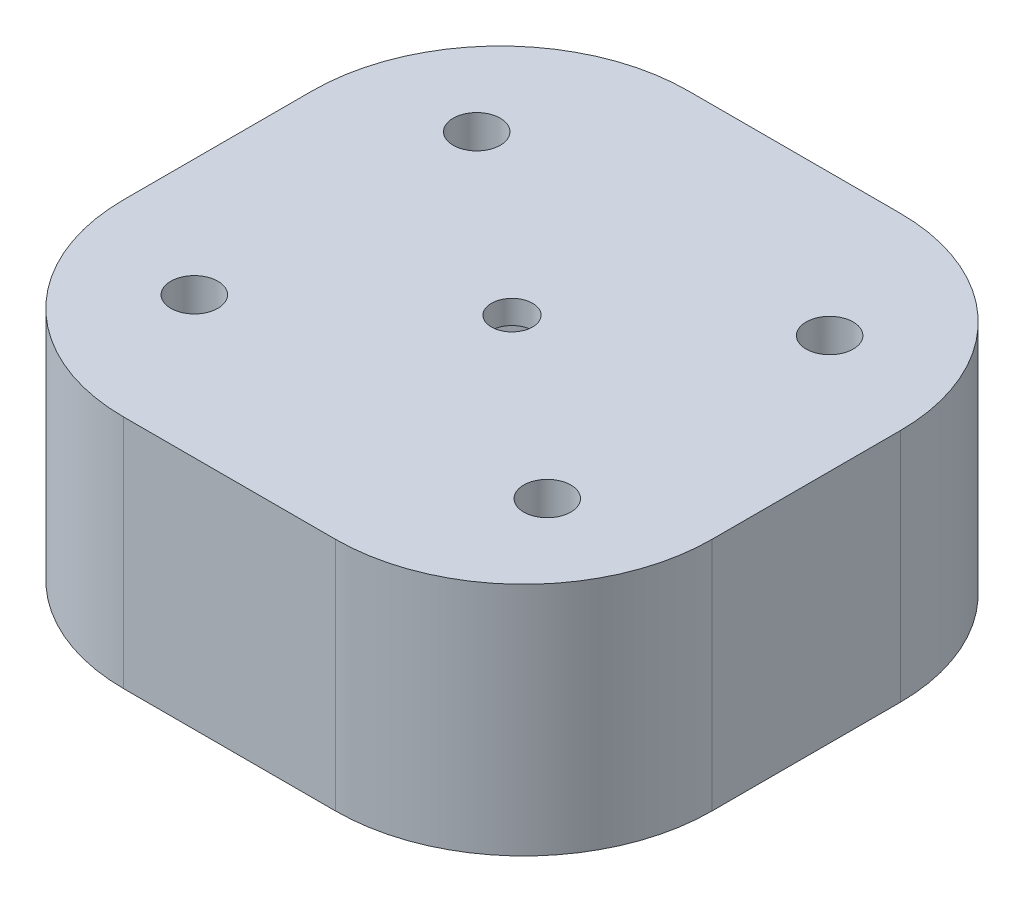
ISO-10303-21;
HEADER;
FILE_DESCRIPTION(('STEP AP214'),'2;1');
FILE_NAME('part.step','',(''),(''),'','','');
FILE_SCHEMA(('AUTOMOTIVE_DESIGN { 1 0 10303 214 1 1 1 1 }'));
ENDSEC;
DATA;
#1=APPLICATION_CONTEXT('core data for automotive mechanical design processes');
#2=APPLICATION_PROTOCOL_DEFINITION('international standard','automotive_design',2000,#1);
#3=PRODUCT_CONTEXT('',#1,'mechanical');
#4=PRODUCT('Part','Part','',(#3));
#5=PRODUCT_RELATED_PRODUCT_CATEGORY('part','',(#4));
#6=PRODUCT_DEFINITION_FORMATION('','',#4);
#7=PRODUCT_DEFINITION_CONTEXT('part definition',#1,'design');
#8=PRODUCT_DEFINITION('design','',#6,#7);
#9=PRODUCT_DEFINITION_SHAPE('','',#8);
#10=(LENGTH_UNIT() NAMED_UNIT(*) SI_UNIT(.MILLI.,.METRE.));
#11=(NAMED_UNIT(*) PLANE_ANGLE_UNIT() SI_UNIT($,.RADIAN.));
#12=(NAMED_UNIT(*) SI_UNIT($,.STERADIAN.) SOLID_ANGLE_UNIT());
#13=UNCERTAINTY_MEASURE_WITH_UNIT(LENGTH_MEASURE(1.E-05),#10,'distance_accuracy_value','');
#14=(GEOMETRIC_REPRESENTATION_CONTEXT(3) GLOBAL_UNCERTAINTY_ASSIGNED_CONTEXT((#13)) GLOBAL_UNIT_ASSIGNED_CONTEXT((#10,
#11,#12)) REPRESENTATION_CONTEXT('',''));
#15=CARTESIAN_POINT('',(0.,0.,0.));
#16=DIRECTION('',(0.,0.,1.));
#17=DIRECTION('',(1.,0.,0.));
#18=AXIS2_PLACEMENT_3D('',#15,#16,#17);
#19=CARTESIAN_POINT('',(-9.00000037252903,0.,8.00000020861626));
#20=DIRECTION('',(0.,1.,0.));
#21=DIRECTION('',(0.,0.,1.));
#22=AXIS2_PLACEMENT_3D('',#19,#20,#21);
#23=PLANE('',#22);
#24=CARTESIAN_POINT('',(-9.00000037252903,0.,8.00000020861626));
#25=DIRECTION('',(0.,1.,0.));
#26=DIRECTION('',(0.,0.,1.));
#27=AXIS2_PLACEMENT_3D('',#24,#25,#26);
#28=CIRCLE('',#27,16.);
#29=CARTESIAN_POINT('',(-25.000000372529,0.,8.00000020861614));
#30=VERTEX_POINT('',#29);
#31=CARTESIAN_POINT('',(-9.00000037252891,0.,24.0000002086163));
#32=VERTEX_POINT('',#31);
#33=EDGE_CURVE('E141',#30,#32,#28,.T.);
#34=ORIENTED_EDGE('',*,*,#33,.F.);
#35=DIRECTION('',(0.,0.,1.));
#36=VECTOR('',#35,1.);
#37=CARTESIAN_POINT('',(-25.000000372529,0.,8.00000020861614));
#38=LINE('',#37,#36);
#39=CARTESIAN_POINT('',(-25.000000372529,0.,-8.00000020861614));
#40=VERTEX_POINT('',#39);
#41=EDGE_CURVE('E56',#40,#30,#38,.T.);
#42=ORIENTED_EDGE('',*,*,#41,.F.);
#43=CARTESIAN_POINT('',(-9.00000037252903,0.,-8.00000020861626));
#44=DIRECTION('',(0.,1.,0.));
#45=DIRECTION('',(0.,0.,-1.));
#46=AXIS2_PLACEMENT_3D('',#43,#44,#45);
#47=CIRCLE('',#46,16.);
#48=CARTESIAN_POINT('',(-9.00000037252903,0.,-24.0000002086163));
#49=VERTEX_POINT('',#48);
#50=EDGE_CURVE('E235',#49,#40,#47,.T.);
#51=ORIENTED_EDGE('',*,*,#50,.F.);
#52=DIRECTION('',(-1.,0.,0.));
#53=VECTOR('',#52,1.);
#54=CARTESIAN_POINT('',(-9.00000037252891,0.,-24.0000002086163));
#55=LINE('',#54,#53);
#56=CARTESIAN_POINT('',(9.00000037252892,0.,-24.0000002086163));
#57=VERTEX_POINT('',#56);
#58=EDGE_CURVE('E233',#57,#49,#55,.T.);
#59=ORIENTED_EDGE('',*,*,#58,.F.);
#60=CARTESIAN_POINT('',(9.00000037252903,0.,-8.00000020861626));
#61=DIRECTION('',(0.,1.,0.));
#62=DIRECTION('',(0.,0.,1.));
#63=AXIS2_PLACEMENT_3D('',#60,#61,#62);
#64=CIRCLE('',#63,16.);
#65=CARTESIAN_POINT('',(25.000000372529,0.,-8.00000020861614));
#66=VERTEX_POINT('',#65);
#67=EDGE_CURVE('E231',#66,#57,#64,.T.);
#68=ORIENTED_EDGE('',*,*,#67,.F.);
#69=DIRECTION('',(0.,0.,-1.));
#70=VECTOR('',#69,1.);
#71=CARTESIAN_POINT('',(25.000000372529,0.,-8.00000020861614));
#72=LINE('',#71,#70);
#73=CARTESIAN_POINT('',(25.000000372529,0.,8.00000020861614));
#74=VERTEX_POINT('',#73);
#75=EDGE_CURVE('E229',#74,#66,#72,.T.);
#76=ORIENTED_EDGE('',*,*,#75,.F.);
#77=CARTESIAN_POINT('',(9.00000037252903,0.,8.00000020861626));
#78=DIRECTION('',(0.,1.,0.));
#79=DIRECTION('',(0.,0.,1.));
#80=AXIS2_PLACEMENT_3D('',#77,#78,#79);
#81=CIRCLE('',#80,16.);
#82=CARTESIAN_POINT('',(9.00000037252891,0.,24.0000002086163));
#83=VERTEX_POINT('',#82);
#84=EDGE_CURVE('E227',#83,#74,#81,.T.);
#85=ORIENTED_EDGE('',*,*,#84,.F.);
#86=DIRECTION('',(1.,0.,0.));
#87=VECTOR('',#86,1.);
#88=CARTESIAN_POINT('',(9.00000037252892,0.,24.0000002086163));
#89=LINE('',#88,#87);
#90=EDGE_CURVE('E225',#32,#83,#89,.T.);
#91=ORIENTED_EDGE('',*,*,#90,.F.);
#92=EDGE_LOOP('',(#34,#42,#51,#59,#68,#76,#85,#91));
#93=FACE_BOUND('',#92,.T.);
#94=DIRECTION('',(-0.866025403784438,0.,-0.5));
#95=VECTOR('',#94,1.);
#96=CARTESIAN_POINT('',(6.25,0.,-3.60843918243517));
#97=LINE('',#96,#95);
#98=CARTESIAN_POINT('',(6.25,0.,-3.60843918243517));
#99=VERTEX_POINT('',#98);
#100=CARTESIAN_POINT('',(0.,0.,-7.21687836487033));
#101=VERTEX_POINT('',#100);
#102=EDGE_CURVE('E48',#99,#101,#97,.T.);
#103=ORIENTED_EDGE('',*,*,#102,.T.);
#104=DIRECTION('',(-0.866025403784439,0.,0.5));
#105=VECTOR('',#104,1.);
#106=CARTESIAN_POINT('',(0.,0.,-7.21687836487033));
#107=LINE('',#106,#105);
#108=CARTESIAN_POINT('',(-6.25,0.,-3.60843918243517));
#109=VERTEX_POINT('',#108);
#110=EDGE_CURVE('E199',#101,#109,#107,.T.);
#111=ORIENTED_EDGE('',*,*,#110,.T.);
#112=DIRECTION('',(0.,0.,1.));
#113=VECTOR('',#112,1.);
#114=CARTESIAN_POINT('',(-6.25,0.,-3.60843918243517));
#115=LINE('',#114,#113);
#116=CARTESIAN_POINT('',(-6.25,0.,3.60843918243516));
#117=VERTEX_POINT('',#116);
#118=EDGE_CURVE('E202',#109,#117,#115,.T.);
#119=ORIENTED_EDGE('',*,*,#118,.T.);
#120=DIRECTION('',(0.866025403784439,0.,0.5));
#121=VECTOR('',#120,1.);
#122=CARTESIAN_POINT('',(-6.25,0.,3.60843918243516));
#123=LINE('',#122,#121);
#124=CARTESIAN_POINT('',(0.,0.,7.21687836487032));
#125=VERTEX_POINT('',#124);
#126=EDGE_CURVE('E205',#117,#125,#123,.T.);
#127=ORIENTED_EDGE('',*,*,#126,.T.);
#128=DIRECTION('',(0.866025403784439,0.,-0.5));
#129=VECTOR('',#128,1.);
#130=CARTESIAN_POINT('',(0.,0.,7.21687836487032));
#131=LINE('',#130,#129);
#132=CARTESIAN_POINT('',(6.25,0.,3.60843918243516));
#133=VERTEX_POINT('',#132);
#134=EDGE_CURVE('E208',#125,#133,#131,.T.);
#135=ORIENTED_EDGE('',*,*,#134,.T.);
#136=DIRECTION('',(0.,0.,-1.));
#137=VECTOR('',#136,1.);
#138=CARTESIAN_POINT('',(6.25,0.,3.60843918243516));
#139=LINE('',#138,#137);
#140=EDGE_CURVE('E182',#133,#99,#139,.T.);
#141=ORIENTED_EDGE('',*,*,#140,.T.);
#142=EDGE_LOOP('',(#103,#111,#119,#127,#135,#141));
#143=FACE_BOUND('',#142,.T.);
#144=ADVANCED_FACE('F33',(#93,#143),#23,.F.);
#145=CARTESIAN_POINT('',(-9.00000037252903,18.,8.00000020861626));
#146=DIRECTION('',(0.,-1.,0.));
#147=DIRECTION('',(0.,0.,-1.));
#148=AXIS2_PLACEMENT_3D('',#145,#146,#147);
#149=CYLINDRICAL_SURFACE('',#148,16.);
#150=ORIENTED_EDGE('',*,*,#33,.T.);
#151=DIRECTION('',(0.,-1.,0.));
#152=VECTOR('',#151,1.);
#153=CARTESIAN_POINT('',(-9.00000037252891,18.,24.0000002086163));
#154=LINE('',#153,#152);
#155=CARTESIAN_POINT('',(-9.00000037252899,20.,24.0000002086164));
#156=VERTEX_POINT('',#155);
#157=EDGE_CURVE('E11',#156,#32,#154,.T.);
#158=ORIENTED_EDGE('',*,*,#157,.F.);
#159=CARTESIAN_POINT('',(-9.000000372529,20.,8.00000020861628));
#160=DIRECTION('',(0.,1.,0.));
#161=DIRECTION('',(0.,0.,1.));
#162=AXIS2_PLACEMENT_3D('',#159,#160,#161);
#163=CIRCLE('',#162,16.0000000000001);
#164=CARTESIAN_POINT('',(-25.0000003725291,20.,8.00000020861628));
#165=VERTEX_POINT('',#164);
#166=EDGE_CURVE('E139',#165,#156,#163,.T.);
#167=ORIENTED_EDGE('',*,*,#166,.F.);
#168=DIRECTION('',(0.,-1.,0.));
#169=VECTOR('',#168,1.);
#170=CARTESIAN_POINT('',(-25.000000372529,18.,8.00000020861614));
#171=LINE('',#170,#169);
#172=EDGE_CURVE('E238',#165,#30,#171,.T.);
#173=ORIENTED_EDGE('',*,*,#172,.T.);
#174=EDGE_LOOP('',(#150,#158,#167,#173));
#175=FACE_BOUND('',#174,.T.);
#176=ADVANCED_FACE('F35',(#175),#149,.T.);
#177=CARTESIAN_POINT('',(9.00000037252892,18.,24.0000002086163));
#178=DIRECTION('',(0.,0.,-1.));
#179=DIRECTION('',(-1.,0.,0.));
#180=AXIS2_PLACEMENT_3D('',#177,#178,#179);
#181=PLANE('',#180);
#182=ORIENTED_EDGE('',*,*,#90,.T.);
#183=DIRECTION('',(0.,-1.,0.));
#184=VECTOR('',#183,1.);
#185=CARTESIAN_POINT('',(9.00000037252891,18.,24.0000002086163));
#186=LINE('',#185,#184);
#187=CARTESIAN_POINT('',(9.00000037252899,20.,24.0000002086164));
#188=VERTEX_POINT('',#187);
#189=EDGE_CURVE('E41',#188,#83,#186,.T.);
#190=ORIENTED_EDGE('',*,*,#189,.F.);
#191=DIRECTION('',(1.,0.,0.));
#192=VECTOR('',#191,1.);
#193=CARTESIAN_POINT('',(9.00000037252899,20.,24.0000002086164));
#194=LINE('',#193,#192);
#195=EDGE_CURVE('E144',#156,#188,#194,.T.);
#196=ORIENTED_EDGE('',*,*,#195,.F.);
#197=ORIENTED_EDGE('',*,*,#157,.T.);
#198=EDGE_LOOP('',(#182,#190,#196,#197));
#199=FACE_BOUND('',#198,.T.);
#200=ADVANCED_FACE('F145',(#199),#181,.F.);
#201=CARTESIAN_POINT('',(9.00000037252903,18.,8.00000020861626));
#202=DIRECTION('',(0.,-1.,0.));
#203=DIRECTION('',(0.,0.,-1.));
#204=AXIS2_PLACEMENT_3D('',#201,#202,#203);
#205=CYLINDRICAL_SURFACE('',#204,16.);
#206=ORIENTED_EDGE('',*,*,#84,.T.);
#207=DIRECTION('',(0.,-1.,0.));
#208=VECTOR('',#207,1.);
#209=CARTESIAN_POINT('',(25.000000372529,18.,8.00000020861614));
#210=LINE('',#209,#208);
#211=CARTESIAN_POINT('',(25.0000003725291,20.,8.00000020861628));
#212=VERTEX_POINT('',#211);
#213=EDGE_CURVE('E251',#212,#74,#210,.T.);
#214=ORIENTED_EDGE('',*,*,#213,.F.);
#215=CARTESIAN_POINT('',(9.00000037252899,20.,8.00000020861628));
#216=DIRECTION('',(0.,1.,0.));
#217=DIRECTION('',(0.,0.,1.));
#218=AXIS2_PLACEMENT_3D('',#215,#216,#217);
#219=CIRCLE('',#218,16.0000000000001);
#220=EDGE_CURVE('E150',#188,#212,#219,.T.);
#221=ORIENTED_EDGE('',*,*,#220,.F.);
#222=ORIENTED_EDGE('',*,*,#189,.T.);
#223=EDGE_LOOP('',(#206,#214,#221,#222));
#224=FACE_BOUND('',#223,.T.);
#225=ADVANCED_FACE('F255',(#224),#205,.T.);
#226=CARTESIAN_POINT('',(25.000000372529,18.,-8.00000020861614));
#227=DIRECTION('',(-1.,0.,0.));
#228=DIRECTION('',(0.,0.,1.));
#229=AXIS2_PLACEMENT_3D('',#226,#227,#228);
#230=PLANE('',#229);
#231=ORIENTED_EDGE('',*,*,#75,.T.);
#232=DIRECTION('',(0.,-1.,0.));
#233=VECTOR('',#232,1.);
#234=CARTESIAN_POINT('',(25.000000372529,18.,-8.00000020861614));
#235=LINE('',#234,#233);
#236=CARTESIAN_POINT('',(25.000000372529,20.,-8.00000020861627));
#237=VERTEX_POINT('',#236);
#238=EDGE_CURVE('E248',#237,#66,#235,.T.);
#239=ORIENTED_EDGE('',*,*,#238,.F.);
#240=DIRECTION('',(0.,0.,-1.));
#241=VECTOR('',#240,1.);
#242=CARTESIAN_POINT('',(25.0000003725291,20.,-8.00000020861628));
#243=LINE('',#242,#241);
#244=EDGE_CURVE('E166',#212,#237,#243,.T.);
#245=ORIENTED_EDGE('',*,*,#244,.F.);
#246=ORIENTED_EDGE('',*,*,#213,.T.);
#247=EDGE_LOOP('',(#231,#239,#245,#246));
#248=FACE_BOUND('',#247,.T.);
#249=ADVANCED_FACE('F262',(#248),#230,.F.);
#250=CARTESIAN_POINT('',(9.00000037252903,18.,-8.00000020861626));
#251=DIRECTION('',(0.,-1.,0.));
#252=DIRECTION('',(0.,0.,-1.));
#253=AXIS2_PLACEMENT_3D('',#250,#251,#252);
#254=CYLINDRICAL_SURFACE('',#253,16.);
#255=ORIENTED_EDGE('',*,*,#67,.T.);
#256=DIRECTION('',(0.,-1.,0.));
#257=VECTOR('',#256,1.);
#258=CARTESIAN_POINT('',(9.00000037252892,18.,-24.0000002086163));
#259=LINE('',#258,#257);
#260=CARTESIAN_POINT('',(9.00000037252899,20.,-24.0000002086163));
#261=VERTEX_POINT('',#260);
#262=EDGE_CURVE('E245',#261,#57,#259,.T.);
#263=ORIENTED_EDGE('',*,*,#262,.F.);
#264=CARTESIAN_POINT('',(9.00000037252899,20.,-8.00000020861628));
#265=DIRECTION('',(0.,1.,0.));
#266=DIRECTION('',(0.,0.,1.));
#267=AXIS2_PLACEMENT_3D('',#264,#265,#266);
#268=CIRCLE('',#267,16.);
#269=EDGE_CURVE('E169',#237,#261,#268,.T.);
#270=ORIENTED_EDGE('',*,*,#269,.F.);
#271=ORIENTED_EDGE('',*,*,#238,.T.);
#272=EDGE_LOOP('',(#255,#263,#270,#271));
#273=FACE_BOUND('',#272,.T.);
#274=ADVANCED_FACE('F266',(#273),#254,.T.);
#275=CARTESIAN_POINT('',(-9.00000037252891,18.,-24.0000002086163));
#276=DIRECTION('',(0.,0.,1.));
#277=DIRECTION('',(1.,0.,0.));
#278=AXIS2_PLACEMENT_3D('',#275,#276,#277);
#279=PLANE('',#278);
#280=ORIENTED_EDGE('',*,*,#58,.T.);
#281=DIRECTION('',(0.,-1.,0.));
#282=VECTOR('',#281,1.);
#283=CARTESIAN_POINT('',(-9.00000037252903,18.,-24.0000002086163));
#284=LINE('',#283,#282);
#285=CARTESIAN_POINT('',(-9.000000372529,20.,-24.0000002086163));
#286=VERTEX_POINT('',#285);
#287=EDGE_CURVE('E242',#286,#49,#284,.T.);
#288=ORIENTED_EDGE('',*,*,#287,.F.);
#289=DIRECTION('',(-1.,0.,0.));
#290=VECTOR('',#289,1.);
#291=CARTESIAN_POINT('',(-9.000000372529,20.,-24.0000002086163));
#292=LINE('',#291,#290);
#293=EDGE_CURVE('E172',#261,#286,#292,.T.);
#294=ORIENTED_EDGE('',*,*,#293,.F.);
#295=ORIENTED_EDGE('',*,*,#262,.T.);
#296=EDGE_LOOP('',(#280,#288,#294,#295));
#297=FACE_BOUND('',#296,.T.);
#298=ADVANCED_FACE('F270',(#297),#279,.F.);
#299=CARTESIAN_POINT('',(-9.00000037252903,18.,-8.00000020861626));
#300=DIRECTION('',(0.,-1.,0.));
#301=DIRECTION('',(0.,0.,-1.));
#302=AXIS2_PLACEMENT_3D('',#299,#300,#301);
#303=CYLINDRICAL_SURFACE('',#302,16.);
#304=ORIENTED_EDGE('',*,*,#50,.T.);
#305=DIRECTION('',(0.,-1.,0.));
#306=VECTOR('',#305,1.);
#307=CARTESIAN_POINT('',(-25.000000372529,18.,-8.00000020861614));
#308=LINE('',#307,#306);
#309=CARTESIAN_POINT('',(-25.0000003725291,20.,-8.00000020861628));
#310=VERTEX_POINT('',#309);
#311=EDGE_CURVE('E240',#310,#40,#308,.T.);
#312=ORIENTED_EDGE('',*,*,#311,.F.);
#313=CARTESIAN_POINT('',(-9.000000372529,20.,-8.00000020861628));
#314=DIRECTION('',(0.,1.,0.));
#315=DIRECTION('',(0.,0.,-1.));
#316=AXIS2_PLACEMENT_3D('',#313,#314,#315);
#317=CIRCLE('',#316,16.);
#318=EDGE_CURVE('E175',#286,#310,#317,.T.);
#319=ORIENTED_EDGE('',*,*,#318,.F.);
#320=ORIENTED_EDGE('',*,*,#287,.T.);
#321=EDGE_LOOP('',(#304,#312,#319,#320));
#322=FACE_BOUND('',#321,.T.);
#323=ADVANCED_FACE('F273',(#322),#303,.T.);
#324=CARTESIAN_POINT('',(-25.000000372529,18.,8.00000020861614));
#325=DIRECTION('',(1.,0.,0.));
#326=DIRECTION('',(0.,0.,-1.));
#327=AXIS2_PLACEMENT_3D('',#324,#325,#326);
#328=PLANE('',#327);
#329=ORIENTED_EDGE('',*,*,#41,.T.);
#330=ORIENTED_EDGE('',*,*,#172,.F.);
#331=DIRECTION('',(0.,0.,1.));
#332=VECTOR('',#331,1.);
#333=CARTESIAN_POINT('',(-25.0000003725291,20.,8.00000020861628));
#334=LINE('',#333,#332);
#335=EDGE_CURVE('E157',#310,#165,#334,.T.);
#336=ORIENTED_EDGE('',*,*,#335,.F.);
#337=ORIENTED_EDGE('',*,*,#311,.T.);
#338=EDGE_LOOP('',(#329,#330,#336,#337));
#339=FACE_BOUND('',#338,.T.);
#340=ADVANCED_FACE('F274',(#339),#328,.F.);
#341=CARTESIAN_POINT('',(6.25,18.,-3.60843918243517));
#342=DIRECTION('',(-0.5,0.,0.866025403784439));
#343=DIRECTION('',(0.866025403784439,0.,0.5));
#344=AXIS2_PLACEMENT_3D('',#341,#342,#343);
#345=PLANE('',#344);
#346=ORIENTED_EDGE('',*,*,#102,.F.);
#347=DIRECTION('',(0.,-1.,0.));
#348=VECTOR('',#347,1.);
#349=CARTESIAN_POINT('',(6.25,18.,-3.60843918243517));
#350=LINE('',#349,#348);
#351=CARTESIAN_POINT('',(6.25,18.,-3.60843918243517));
#352=VERTEX_POINT('',#351);
#353=EDGE_CURVE('E197',#352,#99,#350,.T.);
#354=ORIENTED_EDGE('',*,*,#353,.F.);
#355=DIRECTION('',(-0.866025403784438,0.,-0.5));
#356=VECTOR('',#355,1.);
#357=CARTESIAN_POINT('',(6.25,18.,-3.60843918243517));
#358=LINE('',#357,#356);
#359=CARTESIAN_POINT('',(0.,18.,-7.21687836487033));
#360=VERTEX_POINT('',#359);
#361=EDGE_CURVE('E178',#352,#360,#358,.T.);
#362=ORIENTED_EDGE('',*,*,#361,.T.);
#363=DIRECTION('',(0.,-1.,0.));
#364=VECTOR('',#363,1.);
#365=CARTESIAN_POINT('',(0.,18.,-7.21687836487033));
#366=LINE('',#365,#364);
#367=EDGE_CURVE('E222',#360,#101,#366,.T.);
#368=ORIENTED_EDGE('',*,*,#367,.T.);
#369=EDGE_LOOP('',(#346,#354,#362,#368));
#370=FACE_BOUND('',#369,.T.);
#371=ADVANCED_FACE('F276',(#370),#345,.T.);
#372=CARTESIAN_POINT('',(0.,18.,-7.21687836487033));
#373=DIRECTION('',(0.5,0.,0.866025403784439));
#374=DIRECTION('',(0.866025403784439,0.,-0.5));
#375=AXIS2_PLACEMENT_3D('',#372,#373,#374);
#376=PLANE('',#375);
#377=ORIENTED_EDGE('',*,*,#110,.F.);
#378=ORIENTED_EDGE('',*,*,#367,.F.);
#379=DIRECTION('',(-0.866025403784439,0.,0.5));
#380=VECTOR('',#379,1.);
#381=CARTESIAN_POINT('',(0.,18.,-7.21687836487033));
#382=LINE('',#381,#380);
#383=CARTESIAN_POINT('',(-6.25,18.,-3.60843918243517));
#384=VERTEX_POINT('',#383);
#385=EDGE_CURVE('E181',#360,#384,#382,.T.);
#386=ORIENTED_EDGE('',*,*,#385,.T.);
#387=DIRECTION('',(0.,-1.,0.));
#388=VECTOR('',#387,1.);
#389=CARTESIAN_POINT('',(-6.25,18.,-3.60843918243517));
#390=LINE('',#389,#388);
#391=EDGE_CURVE('E220',#384,#109,#390,.T.);
#392=ORIENTED_EDGE('',*,*,#391,.T.);
#393=EDGE_LOOP('',(#377,#378,#386,#392));
#394=FACE_BOUND('',#393,.T.);
#395=ADVANCED_FACE('F282',(#394),#376,.T.);
#396=CARTESIAN_POINT('',(-6.25,18.,-3.60843918243517));
#397=DIRECTION('',(1.,0.,0.));
#398=DIRECTION('',(0.,0.,-1.));
#399=AXIS2_PLACEMENT_3D('',#396,#397,#398);
#400=PLANE('',#399);
#401=ORIENTED_EDGE('',*,*,#118,.F.);
#402=ORIENTED_EDGE('',*,*,#391,.F.);
#403=DIRECTION('',(0.,0.,1.));
#404=VECTOR('',#403,1.);
#405=CARTESIAN_POINT('',(-6.25,18.,-3.60843918243517));
#406=LINE('',#405,#404);
#407=CARTESIAN_POINT('',(-6.25,18.,3.60843918243516));
#408=VERTEX_POINT('',#407);
#409=EDGE_CURVE('E185',#384,#408,#406,.T.);
#410=ORIENTED_EDGE('',*,*,#409,.T.);
#411=DIRECTION('',(0.,-1.,0.));
#412=VECTOR('',#411,1.);
#413=CARTESIAN_POINT('',(-6.25,18.,3.60843918243516));
#414=LINE('',#413,#412);
#415=EDGE_CURVE('E218',#408,#117,#414,.T.);
#416=ORIENTED_EDGE('',*,*,#415,.T.);
#417=EDGE_LOOP('',(#401,#402,#410,#416));
#418=FACE_BOUND('',#417,.T.);
#419=ADVANCED_FACE('F293',(#418),#400,.T.);
#420=CARTESIAN_POINT('',(-6.25,18.,3.60843918243516));
#421=DIRECTION('',(0.5,0.,-0.866025403784439));
#422=DIRECTION('',(-0.866025403784439,0.,-0.5));
#423=AXIS2_PLACEMENT_3D('',#420,#421,#422);
#424=PLANE('',#423);
#425=ORIENTED_EDGE('',*,*,#126,.F.);
#426=ORIENTED_EDGE('',*,*,#415,.F.);
#427=DIRECTION('',(0.866025403784439,0.,0.5));
#428=VECTOR('',#427,1.);
#429=CARTESIAN_POINT('',(-6.25,18.,3.60843918243516));
#430=LINE('',#429,#428);
#431=CARTESIAN_POINT('',(0.,18.,7.21687836487032));
#432=VERTEX_POINT('',#431);
#433=EDGE_CURVE('E188',#408,#432,#430,.T.);
#434=ORIENTED_EDGE('',*,*,#433,.T.);
#435=DIRECTION('',(0.,-1.,0.));
#436=VECTOR('',#435,1.);
#437=CARTESIAN_POINT('',(0.,18.,7.21687836487032));
#438=LINE('',#437,#436);
#439=EDGE_CURVE('E216',#432,#125,#438,.T.);
#440=ORIENTED_EDGE('',*,*,#439,.T.);
#441=EDGE_LOOP('',(#425,#426,#434,#440));
#442=FACE_BOUND('',#441,.T.);
#443=ADVANCED_FACE('F297',(#442),#424,.T.);
#444=CARTESIAN_POINT('',(0.,18.,7.21687836487032));
#445=DIRECTION('',(-0.5,0.,-0.866025403784439));
#446=DIRECTION('',(-0.866025403784439,0.,0.5));
#447=AXIS2_PLACEMENT_3D('',#444,#445,#446);
#448=PLANE('',#447);
#449=ORIENTED_EDGE('',*,*,#134,.F.);
#450=ORIENTED_EDGE('',*,*,#439,.F.);
#451=DIRECTION('',(0.866025403784439,0.,-0.5));
#452=VECTOR('',#451,1.);
#453=CARTESIAN_POINT('',(0.,18.,7.21687836487032));
#454=LINE('',#453,#452);
#455=CARTESIAN_POINT('',(6.25,18.,3.60843918243516));
#456=VERTEX_POINT('',#455);
#457=EDGE_CURVE('E191',#432,#456,#454,.T.);
#458=ORIENTED_EDGE('',*,*,#457,.T.);
#459=DIRECTION('',(0.,-1.,0.));
#460=VECTOR('',#459,1.);
#461=CARTESIAN_POINT('',(6.25,18.,3.60843918243516));
#462=LINE('',#461,#460);
#463=EDGE_CURVE('E214',#456,#133,#462,.T.);
#464=ORIENTED_EDGE('',*,*,#463,.T.);
#465=EDGE_LOOP('',(#449,#450,#458,#464));
#466=FACE_BOUND('',#465,.T.);
#467=ADVANCED_FACE('F301',(#466),#448,.T.);
#468=CARTESIAN_POINT('',(6.25,18.,3.60843918243516));
#469=DIRECTION('',(-1.,0.,0.));
#470=DIRECTION('',(0.,0.,1.));
#471=AXIS2_PLACEMENT_3D('',#468,#469,#470);
#472=PLANE('',#471);
#473=ORIENTED_EDGE('',*,*,#140,.F.);
#474=ORIENTED_EDGE('',*,*,#463,.F.);
#475=DIRECTION('',(0.,0.,-1.));
#476=VECTOR('',#475,1.);
#477=CARTESIAN_POINT('',(6.25,18.,3.60843918243516));
#478=LINE('',#477,#476);
#479=EDGE_CURVE('E194',#456,#352,#478,.T.);
#480=ORIENTED_EDGE('',*,*,#479,.T.);
#481=ORIENTED_EDGE('',*,*,#353,.T.);
#482=EDGE_LOOP('',(#473,#474,#480,#481));
#483=FACE_BOUND('',#482,.T.);
#484=ADVANCED_FACE('F305',(#483),#472,.T.);
#485=CARTESIAN_POINT('',(-9.000000372529,20.,8.00000020861628));
#486=DIRECTION('',(0.,1.,0.));
#487=DIRECTION('',(0.,0.,1.));
#488=AXIS2_PLACEMENT_3D('',#485,#486,#487);
#489=PLANE('',#488);
#490=CARTESIAN_POINT('',(-14.9999999430961,20.,12.0000016956885));
#491=DIRECTION('',(0.,1.,0.));
#492=DIRECTION('',(0.,0.,-1.));
#493=AXIS2_PLACEMENT_3D('',#490,#491,#492);
#494=CIRCLE('',#493,2.);
#495=CARTESIAN_POINT('',(-14.9999999430961,20.,10.0000016956885));
#496=VERTEX_POINT('',#495);
#497=EDGE_CURVE('E373',#496,#496,#494,.T.);
#498=ORIENTED_EDGE('',*,*,#497,.F.);
#499=EDGE_LOOP('',(#498));
#500=FACE_BOUND('',#499,.T.);
#501=CARTESIAN_POINT('',(14.9999999430961,20.,-12.0000016956885));
#502=DIRECTION('',(0.,1.,0.));
#503=DIRECTION('',(0.,0.,-1.));
#504=AXIS2_PLACEMENT_3D('',#501,#502,#503);
#505=CIRCLE('',#504,2.);
#506=CARTESIAN_POINT('',(14.9999999430961,20.,-14.0000016956885));
#507=VERTEX_POINT('',#506);
#508=EDGE_CURVE('E161',#507,#507,#505,.T.);
#509=ORIENTED_EDGE('',*,*,#508,.F.);
#510=EDGE_LOOP('',(#509));
#511=FACE_BOUND('',#510,.T.);
#512=ORIENTED_EDGE('',*,*,#166,.T.);
#513=ORIENTED_EDGE('',*,*,#195,.T.);
#514=ORIENTED_EDGE('',*,*,#220,.T.);
#515=ORIENTED_EDGE('',*,*,#244,.T.);
#516=ORIENTED_EDGE('',*,*,#269,.T.);
#517=ORIENTED_EDGE('',*,*,#293,.T.);
#518=ORIENTED_EDGE('',*,*,#318,.T.);
#519=ORIENTED_EDGE('',*,*,#335,.T.);
#520=EDGE_LOOP('',(#512,#513,#514,#515,#516,#517,#518,#519));
#521=FACE_BOUND('',#520,.T.);
#522=CARTESIAN_POINT('',(-14.9999999430961,20.,-12.0000016956885));
#523=DIRECTION('',(0.,1.,0.));
#524=DIRECTION('',(0.,0.,1.));
#525=AXIS2_PLACEMENT_3D('',#522,#523,#524);
#526=CIRCLE('',#525,2.);
#527=CARTESIAN_POINT('',(-14.9999999430961,20.,-10.0000016956885));
#528=VERTEX_POINT('',#527);
#529=EDGE_CURVE('E158',#528,#528,#526,.T.);
#530=ORIENTED_EDGE('',*,*,#529,.F.);
#531=EDGE_LOOP('',(#530));
#532=FACE_BOUND('',#531,.T.);
#533=CARTESIAN_POINT('',(14.9999999430961,20.,12.0000016956885));
#534=DIRECTION('',(0.,1.,0.));
#535=DIRECTION('',(0.,0.,1.));
#536=AXIS2_PLACEMENT_3D('',#533,#534,#535);
#537=CIRCLE('',#536,2.);
#538=CARTESIAN_POINT('',(14.9999999430961,20.,14.0000016956885));
#539=VERTEX_POINT('',#538);
#540=EDGE_CURVE('E378',#539,#539,#537,.T.);
#541=ORIENTED_EDGE('',*,*,#540,.F.);
#542=EDGE_LOOP('',(#541));
#543=FACE_BOUND('',#542,.T.);
#544=CARTESIAN_POINT('',(0.,20.,0.));
#545=DIRECTION('',(0.,1.,0.));
#546=DIRECTION('',(0.,0.,1.));
#547=AXIS2_PLACEMENT_3D('',#544,#545,#546);
#548=CIRCLE('',#547,1.75);
#549=CARTESIAN_POINT('',(0.,20.,1.75));
#550=VERTEX_POINT('',#549);
#551=EDGE_CURVE('E370',#550,#550,#548,.T.);
#552=ORIENTED_EDGE('',*,*,#551,.F.);
#553=EDGE_LOOP('',(#552));
#554=FACE_BOUND('',#553,.T.);
#555=ADVANCED_FACE('F153',(#500,#511,#521,#532,#543,#554),#489,.T.);
#556=CARTESIAN_POINT('',(-9.000000372529,18.,8.00000020861628));
#557=DIRECTION('',(0.,1.,0.));
#558=DIRECTION('',(0.,0.,1.));
#559=AXIS2_PLACEMENT_3D('',#556,#557,#558);
#560=PLANE('',#559);
#561=ORIENTED_EDGE('',*,*,#385,.F.);
#562=ORIENTED_EDGE('',*,*,#361,.F.);
#563=ORIENTED_EDGE('',*,*,#479,.F.);
#564=ORIENTED_EDGE('',*,*,#457,.F.);
#565=ORIENTED_EDGE('',*,*,#433,.F.);
#566=ORIENTED_EDGE('',*,*,#409,.F.);
#567=EDGE_LOOP('',(#561,#562,#563,#564,#565,#566));
#568=FACE_BOUND('',#567,.T.);
#569=CARTESIAN_POINT('',(0.,18.,0.));
#570=DIRECTION('',(0.,1.,0.));
#571=DIRECTION('',(0.,0.,1.));
#572=AXIS2_PLACEMENT_3D('',#569,#570,#571);
#573=CIRCLE('',#572,1.75);
#574=CARTESIAN_POINT('',(0.,18.,1.75));
#575=VERTEX_POINT('',#574);
#576=EDGE_CURVE('E362',#575,#575,#573,.T.);
#577=ORIENTED_EDGE('',*,*,#576,.T.);
#578=EDGE_LOOP('',(#577));
#579=FACE_BOUND('',#578,.T.);
#580=ADVANCED_FACE('F310',(#568,#579),#560,.F.);
#581=CARTESIAN_POINT('',(-14.9999999430961,20.,-12.0000016956885));
#582=DIRECTION('',(0.,-1.,0.));
#583=DIRECTION('',(0.,0.,-1.));
#584=AXIS2_PLACEMENT_3D('',#581,#582,#583);
#585=CYLINDRICAL_SURFACE('',#584,2.);
#586=ORIENTED_EDGE('',*,*,#529,.T.);
#587=EDGE_LOOP('',(#586));
#588=FACE_BOUND('',#587,.T.);
#589=CARTESIAN_POINT('',(-14.9999999430961,10.,-12.0000016956885));
#590=DIRECTION('',(0.,1.,0.));
#591=DIRECTION('',(0.,0.,1.));
#592=AXIS2_PLACEMENT_3D('',#589,#590,#591);
#593=CIRCLE('',#592,2.);
#594=CARTESIAN_POINT('',(-14.9999999430961,10.,-10.0000016956885));
#595=VERTEX_POINT('',#594);
#596=EDGE_CURVE('E358',#595,#595,#593,.T.);
#597=ORIENTED_EDGE('',*,*,#596,.F.);
#598=EDGE_LOOP('',(#597));
#599=FACE_BOUND('',#598,.T.);
#600=ADVANCED_FACE('F313',(#588,#599),#585,.F.);
#601=CARTESIAN_POINT('',(14.9999999430961,20.,-12.0000016956885));
#602=DIRECTION('',(0.,-1.,0.));
#603=DIRECTION('',(0.,0.,-1.));
#604=AXIS2_PLACEMENT_3D('',#601,#602,#603);
#605=CYLINDRICAL_SURFACE('',#604,2.);
#606=ORIENTED_EDGE('',*,*,#508,.T.);
#607=EDGE_LOOP('',(#606));
#608=FACE_BOUND('',#607,.T.);
#609=CARTESIAN_POINT('',(14.9999999430961,10.,-12.0000016956885));
#610=DIRECTION('',(0.,1.,0.));
#611=DIRECTION('',(0.,0.,1.));
#612=AXIS2_PLACEMENT_3D('',#609,#610,#611);
#613=CIRCLE('',#612,2.);
#614=CARTESIAN_POINT('',(14.9999999430961,10.,-10.0000016956885));
#615=VERTEX_POINT('',#614);
#616=EDGE_CURVE('E356',#615,#615,#613,.T.);
#617=ORIENTED_EDGE('',*,*,#616,.F.);
#618=EDGE_LOOP('',(#617));
#619=FACE_BOUND('',#618,.T.);
#620=ADVANCED_FACE('F320',(#608,#619),#605,.F.);
#621=CARTESIAN_POINT('',(14.9999999430961,20.,12.0000016956885));
#622=DIRECTION('',(0.,-1.,0.));
#623=DIRECTION('',(0.,0.,-1.));
#624=AXIS2_PLACEMENT_3D('',#621,#622,#623);
#625=CYLINDRICAL_SURFACE('',#624,2.);
#626=ORIENTED_EDGE('',*,*,#540,.T.);
#627=EDGE_LOOP('',(#626));
#628=FACE_BOUND('',#627,.T.);
#629=CARTESIAN_POINT('',(14.9999999430961,10.,12.0000016956885));
#630=DIRECTION('',(0.,1.,0.));
#631=DIRECTION('',(0.,0.,1.));
#632=AXIS2_PLACEMENT_3D('',#629,#630,#631);
#633=CIRCLE('',#632,2.);
#634=CARTESIAN_POINT('',(14.9999999430961,10.,14.0000016956885));
#635=VERTEX_POINT('',#634);
#636=EDGE_CURVE('E359',#635,#635,#633,.T.);
#637=ORIENTED_EDGE('',*,*,#636,.F.);
#638=EDGE_LOOP('',(#637));
#639=FACE_BOUND('',#638,.T.);
#640=ADVANCED_FACE('F324',(#628,#639),#625,.F.);
#641=CARTESIAN_POINT('',(-14.9999999430961,20.,12.0000016956885));
#642=DIRECTION('',(0.,-1.,0.));
#643=DIRECTION('',(0.,0.,-1.));
#644=AXIS2_PLACEMENT_3D('',#641,#642,#643);
#645=CYLINDRICAL_SURFACE('',#644,2.);
#646=ORIENTED_EDGE('',*,*,#497,.T.);
#647=EDGE_LOOP('',(#646));
#648=FACE_BOUND('',#647,.T.);
#649=CARTESIAN_POINT('',(-14.9999999430961,10.,12.0000016956885));
#650=DIRECTION('',(0.,1.,0.));
#651=DIRECTION('',(0.,0.,1.));
#652=AXIS2_PLACEMENT_3D('',#649,#650,#651);
#653=CIRCLE('',#652,2.);
#654=CARTESIAN_POINT('',(-14.9999999430961,10.,14.0000016956885));
#655=VERTEX_POINT('',#654);
#656=EDGE_CURVE('E365',#655,#655,#653,.T.);
#657=ORIENTED_EDGE('',*,*,#656,.F.);
#658=EDGE_LOOP('',(#657));
#659=FACE_BOUND('',#658,.T.);
#660=ADVANCED_FACE('F328',(#648,#659),#645,.F.);
#661=CARTESIAN_POINT('',(0.,20.,0.));
#662=DIRECTION('',(0.,-1.,0.));
#663=DIRECTION('',(0.,0.,-1.));
#664=AXIS2_PLACEMENT_3D('',#661,#662,#663);
#665=CYLINDRICAL_SURFACE('',#664,1.75);
#666=ORIENTED_EDGE('',*,*,#551,.T.);
#667=EDGE_LOOP('',(#666));
#668=FACE_BOUND('',#667,.T.);
#669=ORIENTED_EDGE('',*,*,#576,.F.);
#670=EDGE_LOOP('',(#669));
#671=FACE_BOUND('',#670,.T.);
#672=ADVANCED_FACE('F332',(#668,#671),#665,.F.);
#673=CARTESIAN_POINT('',(-14.9999999430961,10.,12.0000016956885));
#674=DIRECTION('',(0.,1.,0.));
#675=DIRECTION('',(0.,0.,1.));
#676=AXIS2_PLACEMENT_3D('',#673,#674,#675);
#677=PLANE('',#676);
#678=ORIENTED_EDGE('',*,*,#656,.T.);
#679=EDGE_LOOP('',(#678));
#680=FACE_BOUND('',#679,.T.);
#681=ADVANCED_FACE('F336',(#680),#677,.T.);
#682=CARTESIAN_POINT('',(-14.9999999430961,10.,-12.0000016956885));
#683=DIRECTION('',(0.,1.,0.));
#684=DIRECTION('',(0.,0.,1.));
#685=AXIS2_PLACEMENT_3D('',#682,#683,#684);
#686=PLANE('',#685);
#687=ORIENTED_EDGE('',*,*,#596,.T.);
#688=EDGE_LOOP('',(#687));
#689=FACE_BOUND('',#688,.T.);
#690=ADVANCED_FACE('F338',(#689),#686,.T.);
#691=CARTESIAN_POINT('',(14.9999999430961,10.,-12.0000016956885));
#692=DIRECTION('',(0.,1.,0.));
#693=DIRECTION('',(0.,0.,1.));
#694=AXIS2_PLACEMENT_3D('',#691,#692,#693);
#695=PLANE('',#694);
#696=ORIENTED_EDGE('',*,*,#616,.T.);
#697=EDGE_LOOP('',(#696));
#698=FACE_BOUND('',#697,.T.);
#699=ADVANCED_FACE('F341',(#698),#695,.T.);
#700=CARTESIAN_POINT('',(14.9999999430961,10.,12.0000016956885));
#701=DIRECTION('',(0.,1.,0.));
#702=DIRECTION('',(0.,0.,1.));
#703=AXIS2_PLACEMENT_3D('',#700,#701,#702);
#704=PLANE('',#703);
#705=ORIENTED_EDGE('',*,*,#636,.T.);
#706=EDGE_LOOP('',(#705));
#707=FACE_BOUND('',#706,.T.);
#708=ADVANCED_FACE('F346',(#707),#704,.T.);
#709=CLOSED_SHELL('',(#144,#176,#200,#225,#249,#274,#298,#323,#340,#371,#395,#419,#443,#467,
#484,#555,#580,#600,#620,#640,#660,#672,#681,#690,#699,#708));
#710=MANIFOLD_SOLID_BREP('B2',#709);
#711=ADVANCED_BREP_SHAPE_REPRESENTATION('',(#18,#710),#14);
#712=SHAPE_DEFINITION_REPRESENTATION(#9,#711);
ENDSEC;
END-ISO-10303-21;
